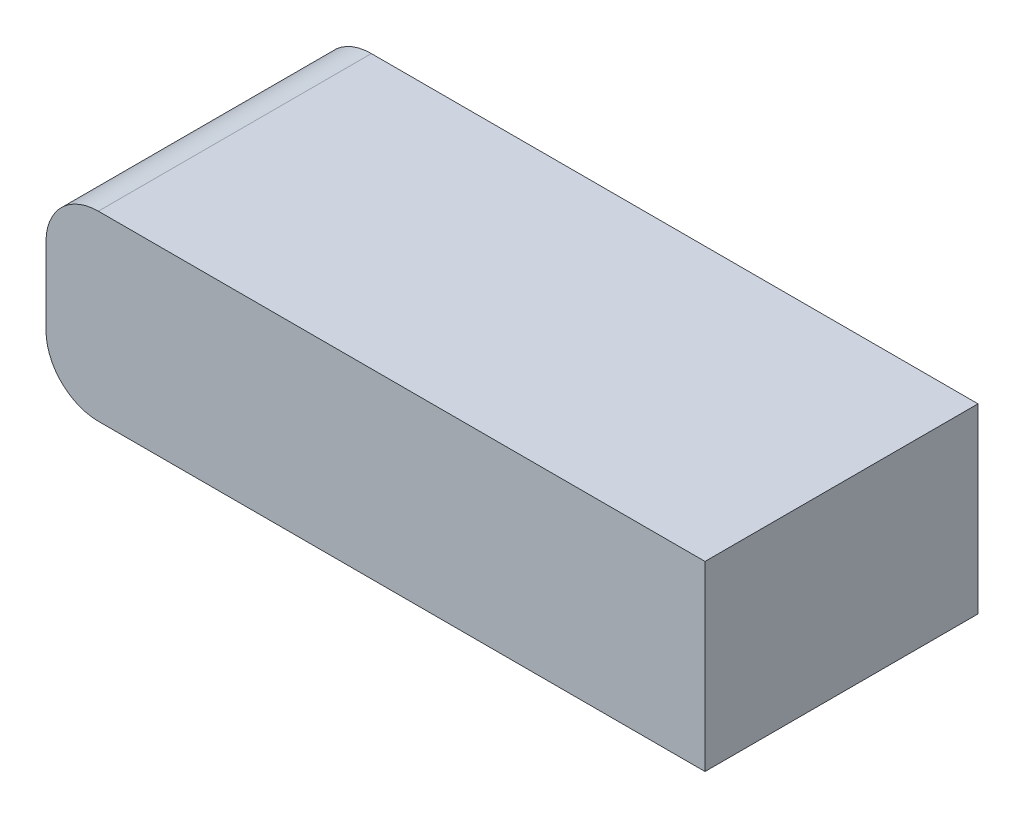
ISO-10303-21;
HEADER;
FILE_DESCRIPTION(('STEP AP214'),'2;1');
FILE_NAME('part.step','',(''),(''),'','','');
FILE_SCHEMA(('AUTOMOTIVE_DESIGN { 1 0 10303 214 1 1 1 1 }'));
ENDSEC;
DATA;
#1=APPLICATION_CONTEXT('core data for automotive mechanical design processes');
#2=APPLICATION_PROTOCOL_DEFINITION('international standard','automotive_design',2000,#1);
#3=PRODUCT_CONTEXT('',#1,'mechanical');
#4=PRODUCT('Part','Part','',(#3));
#5=PRODUCT_RELATED_PRODUCT_CATEGORY('part','',(#4));
#6=PRODUCT_DEFINITION_FORMATION('','',#4);
#7=PRODUCT_DEFINITION_CONTEXT('part definition',#1,'design');
#8=PRODUCT_DEFINITION('design','',#6,#7);
#9=PRODUCT_DEFINITION_SHAPE('','',#8);
#10=(LENGTH_UNIT() NAMED_UNIT(*) SI_UNIT(.MILLI.,.METRE.));
#11=(NAMED_UNIT(*) PLANE_ANGLE_UNIT() SI_UNIT($,.RADIAN.));
#12=(NAMED_UNIT(*) SI_UNIT($,.STERADIAN.) SOLID_ANGLE_UNIT());
#13=UNCERTAINTY_MEASURE_WITH_UNIT(LENGTH_MEASURE(1.E-05),#10,'distance_accuracy_value','');
#14=(GEOMETRIC_REPRESENTATION_CONTEXT(3) GLOBAL_UNCERTAINTY_ASSIGNED_CONTEXT((#13)) GLOBAL_UNIT_ASSIGNED_CONTEXT((#10,
#11,#12)) REPRESENTATION_CONTEXT('',''));
#15=CARTESIAN_POINT('',(0.,0.,0.));
#16=DIRECTION('',(0.,0.,1.));
#17=DIRECTION('',(1.,0.,0.));
#18=AXIS2_PLACEMENT_3D('',#15,#16,#17);
#19=CARTESIAN_POINT('',(0.,30.7028129685967,160.));
#20=DIRECTION('',(0.,0.,-1.));
#21=DIRECTION('',(-1.,0.,0.));
#22=AXIS2_PLACEMENT_3D('',#19,#20,#21);
#23=CYLINDRICAL_SURFACE('',#22,30.7028129685967);
#24=CARTESIAN_POINT('',(0.,30.7028129685967,0.));
#25=DIRECTION('',(0.,0.,1.));
#26=DIRECTION('',(1.,0.,0.));
#27=AXIS2_PLACEMENT_3D('',#24,#25,#26);
#28=CIRCLE('',#27,30.7028129685967);
#29=CARTESIAN_POINT('',(-30.7028129685967,30.7028129685967,0.));
#30=VERTEX_POINT('',#29);
#31=CARTESIAN_POINT('',(0.,0.,0.));
#32=VERTEX_POINT('',#31);
#33=EDGE_CURVE('E117',#30,#32,#28,.T.);
#34=ORIENTED_EDGE('',*,*,#33,.T.);
#35=DIRECTION('',(0.,0.,-1.));
#36=VECTOR('',#35,1.);
#37=CARTESIAN_POINT('',(0.,0.,160.));
#38=LINE('',#37,#36);
#39=CARTESIAN_POINT('',(0.,0.,160.));
#40=VERTEX_POINT('',#39);
#41=EDGE_CURVE('E11',#40,#32,#38,.T.);
#42=ORIENTED_EDGE('',*,*,#41,.F.);
#43=CARTESIAN_POINT('',(0.,30.7028129685967,160.));
#44=DIRECTION('',(0.,0.,1.));
#45=DIRECTION('',(1.,0.,0.));
#46=AXIS2_PLACEMENT_3D('',#43,#44,#45);
#47=CIRCLE('',#46,30.7028129685967);
#48=CARTESIAN_POINT('',(-30.7028129685967,30.7028129685967,160.));
#49=VERTEX_POINT('',#48);
#50=EDGE_CURVE('E127',#49,#40,#47,.T.);
#51=ORIENTED_EDGE('',*,*,#50,.F.);
#52=DIRECTION('',(0.,0.,-1.));
#53=VECTOR('',#52,1.);
#54=CARTESIAN_POINT('',(-30.7028129685967,30.7028129685967,160.));
#55=LINE('',#54,#53);
#56=EDGE_CURVE('E113',#49,#30,#55,.T.);
#57=ORIENTED_EDGE('',*,*,#56,.T.);
#58=EDGE_LOOP('',(#34,#42,#51,#57));
#59=FACE_BOUND('',#58,.T.);
#60=ADVANCED_FACE('F33',(#59),#23,.T.);
#61=CARTESIAN_POINT('',(0.,0.,160.));
#62=DIRECTION('',(0.,1.,0.));
#63=DIRECTION('',(-1.,0.,0.));
#64=AXIS2_PLACEMENT_3D('',#61,#62,#63);
#65=PLANE('',#64);
#66=DIRECTION('',(1.,0.,0.));
#67=VECTOR('',#66,1.);
#68=CARTESIAN_POINT('',(0.,0.,0.));
#69=LINE('',#68,#67);
#70=CARTESIAN_POINT('',(355.55555,0.,0.));
#71=VERTEX_POINT('',#70);
#72=EDGE_CURVE('E120',#32,#71,#69,.T.);
#73=ORIENTED_EDGE('',*,*,#72,.T.);
#74=DIRECTION('',(0.,0.,-1.));
#75=VECTOR('',#74,1.);
#76=CARTESIAN_POINT('',(355.55555,0.,160.));
#77=LINE('',#76,#75);
#78=CARTESIAN_POINT('',(355.55555,0.,160.));
#79=VERTEX_POINT('',#78);
#80=EDGE_CURVE('E41',#79,#71,#77,.T.);
#81=ORIENTED_EDGE('',*,*,#80,.F.);
#82=DIRECTION('',(1.,0.,0.));
#83=VECTOR('',#82,1.);
#84=CARTESIAN_POINT('',(0.,0.,160.));
#85=LINE('',#84,#83);
#86=EDGE_CURVE('E86',#40,#79,#85,.T.);
#87=ORIENTED_EDGE('',*,*,#86,.F.);
#88=ORIENTED_EDGE('',*,*,#41,.T.);
#89=EDGE_LOOP('',(#73,#81,#87,#88));
#90=FACE_BOUND('',#89,.T.);
#91=ADVANCED_FACE('F151',(#90),#65,.F.);
#92=CARTESIAN_POINT('',(355.55555,0.,160.));
#93=DIRECTION('',(-1.,0.,0.));
#94=DIRECTION('',(0.,0.,1.));
#95=AXIS2_PLACEMENT_3D('',#92,#93,#94);
#96=PLANE('',#95);
#97=DIRECTION('',(0.,1.,0.));
#98=VECTOR('',#97,1.);
#99=CARTESIAN_POINT('',(355.55555,0.,0.));
#100=LINE('',#99,#98);
#101=CARTESIAN_POINT('',(355.55555,106.666,0.));
#102=VERTEX_POINT('',#101);
#103=EDGE_CURVE('E122',#71,#102,#100,.T.);
#104=ORIENTED_EDGE('',*,*,#103,.T.);
#105=DIRECTION('',(0.,0.,-1.));
#106=VECTOR('',#105,1.);
#107=CARTESIAN_POINT('',(355.55555,106.666,160.));
#108=LINE('',#107,#106);
#109=CARTESIAN_POINT('',(355.55555,106.666,160.));
#110=VERTEX_POINT('',#109);
#111=EDGE_CURVE('E108',#110,#102,#108,.T.);
#112=ORIENTED_EDGE('',*,*,#111,.F.);
#113=DIRECTION('',(0.,1.,0.));
#114=VECTOR('',#113,1.);
#115=CARTESIAN_POINT('',(355.55555,0.,160.));
#116=LINE('',#115,#114);
#117=EDGE_CURVE('E99',#79,#110,#116,.T.);
#118=ORIENTED_EDGE('',*,*,#117,.F.);
#119=ORIENTED_EDGE('',*,*,#80,.T.);
#120=EDGE_LOOP('',(#104,#112,#118,#119));
#121=FACE_BOUND('',#120,.T.);
#122=ADVANCED_FACE('F133',(#121),#96,.F.);
#123=CARTESIAN_POINT('',(355.55555,106.666,160.));
#124=DIRECTION('',(0.,-1.,0.));
#125=DIRECTION('',(1.,0.,0.));
#126=AXIS2_PLACEMENT_3D('',#123,#124,#125);
#127=PLANE('',#126);
#128=DIRECTION('',(-1.,0.,0.));
#129=VECTOR('',#128,1.);
#130=CARTESIAN_POINT('',(355.55555,106.666,0.));
#131=LINE('',#130,#129);
#132=CARTESIAN_POINT('',(0.,106.666,0.));
#133=VERTEX_POINT('',#132);
#134=EDGE_CURVE('E107',#102,#133,#131,.T.);
#135=ORIENTED_EDGE('',*,*,#134,.T.);
#136=DIRECTION('',(0.,0.,-1.));
#137=VECTOR('',#136,1.);
#138=CARTESIAN_POINT('',(0.,106.666,160.));
#139=LINE('',#138,#137);
#140=CARTESIAN_POINT('',(0.,106.666,160.));
#141=VERTEX_POINT('',#140);
#142=EDGE_CURVE('E104',#141,#133,#139,.T.);
#143=ORIENTED_EDGE('',*,*,#142,.F.);
#144=DIRECTION('',(-1.,0.,0.));
#145=VECTOR('',#144,1.);
#146=CARTESIAN_POINT('',(355.55555,106.666,160.));
#147=LINE('',#146,#145);
#148=EDGE_CURVE('E93',#110,#141,#147,.T.);
#149=ORIENTED_EDGE('',*,*,#148,.F.);
#150=ORIENTED_EDGE('',*,*,#111,.T.);
#151=EDGE_LOOP('',(#135,#143,#149,#150));
#152=FACE_BOUND('',#151,.T.);
#153=ADVANCED_FACE('F105',(#152),#127,.F.);
#154=CARTESIAN_POINT('',(0.,75.9631870314032,160.));
#155=DIRECTION('',(0.,0.,-1.));
#156=DIRECTION('',(-1.,0.,0.));
#157=AXIS2_PLACEMENT_3D('',#154,#155,#156);
#158=CYLINDRICAL_SURFACE('',#157,30.7028129685967);
#159=CARTESIAN_POINT('',(0.,75.9631870314032,0.));
#160=DIRECTION('',(0.,0.,1.));
#161=DIRECTION('',(1.,0.,0.));
#162=AXIS2_PLACEMENT_3D('',#159,#160,#161);
#163=CIRCLE('',#162,30.7028129685967);
#164=CARTESIAN_POINT('',(-30.7028129685967,75.9631870314032,0.));
#165=VERTEX_POINT('',#164);
#166=EDGE_CURVE('E72',#133,#165,#163,.T.);
#167=ORIENTED_EDGE('',*,*,#166,.T.);
#168=DIRECTION('',(0.,0.,-1.));
#169=VECTOR('',#168,1.);
#170=CARTESIAN_POINT('',(-30.7028129685967,75.9631870314032,160.));
#171=LINE('',#170,#169);
#172=CARTESIAN_POINT('',(-30.7028129685967,75.9631870314032,160.));
#173=VERTEX_POINT('',#172);
#174=EDGE_CURVE('E109',#173,#165,#171,.T.);
#175=ORIENTED_EDGE('',*,*,#174,.F.);
#176=CARTESIAN_POINT('',(0.,75.9631870314032,160.));
#177=DIRECTION('',(0.,0.,1.));
#178=DIRECTION('',(1.,0.,0.));
#179=AXIS2_PLACEMENT_3D('',#176,#177,#178);
#180=CIRCLE('',#179,30.7028129685967);
#181=EDGE_CURVE('E97',#141,#173,#180,.T.);
#182=ORIENTED_EDGE('',*,*,#181,.F.);
#183=ORIENTED_EDGE('',*,*,#142,.T.);
#184=EDGE_LOOP('',(#167,#175,#182,#183));
#185=FACE_BOUND('',#184,.T.);
#186=ADVANCED_FACE('F111',(#185),#158,.T.);
#187=CARTESIAN_POINT('',(-30.7028129685967,75.9631870314032,160.));
#188=DIRECTION('',(1.,0.,0.));
#189=DIRECTION('',(0.,1.,0.));
#190=AXIS2_PLACEMENT_3D('',#187,#188,#189);
#191=PLANE('',#190);
#192=DIRECTION('',(0.,-1.,0.));
#193=VECTOR('',#192,1.);
#194=CARTESIAN_POINT('',(-30.7028129685967,75.9631870314032,0.));
#195=LINE('',#194,#193);
#196=EDGE_CURVE('E78',#165,#30,#195,.T.);
#197=ORIENTED_EDGE('',*,*,#196,.T.);
#198=ORIENTED_EDGE('',*,*,#56,.F.);
#199=DIRECTION('',(0.,-1.,0.));
#200=VECTOR('',#199,1.);
#201=CARTESIAN_POINT('',(-30.7028129685967,75.9631870314032,160.));
#202=LINE('',#201,#200);
#203=EDGE_CURVE('E49',#173,#49,#202,.T.);
#204=ORIENTED_EDGE('',*,*,#203,.F.);
#205=ORIENTED_EDGE('',*,*,#174,.T.);
#206=EDGE_LOOP('',(#197,#198,#204,#205));
#207=FACE_BOUND('',#206,.T.);
#208=ADVANCED_FACE('F140',(#207),#191,.F.);
#209=CARTESIAN_POINT('',(0.,30.7028129685967,160.));
#210=DIRECTION('',(0.,0.,1.));
#211=DIRECTION('',(1.,0.,0.));
#212=AXIS2_PLACEMENT_3D('',#209,#210,#211);
#213=PLANE('',#212);
#214=ORIENTED_EDGE('',*,*,#50,.T.);
#215=ORIENTED_EDGE('',*,*,#86,.T.);
#216=ORIENTED_EDGE('',*,*,#117,.T.);
#217=ORIENTED_EDGE('',*,*,#148,.T.);
#218=ORIENTED_EDGE('',*,*,#181,.T.);
#219=ORIENTED_EDGE('',*,*,#203,.T.);
#220=EDGE_LOOP('',(#214,#215,#216,#217,#218,#219));
#221=FACE_BOUND('',#220,.T.);
#222=ADVANCED_FACE('F95',(#221),#213,.T.);
#223=CARTESIAN_POINT('',(0.,30.7028129685967,0.));
#224=DIRECTION('',(0.,0.,1.));
#225=DIRECTION('',(1.,0.,0.));
#226=AXIS2_PLACEMENT_3D('',#223,#224,#225);
#227=PLANE('',#226);
#228=ORIENTED_EDGE('',*,*,#33,.F.);
#229=ORIENTED_EDGE('',*,*,#196,.F.);
#230=ORIENTED_EDGE('',*,*,#166,.F.);
#231=ORIENTED_EDGE('',*,*,#134,.F.);
#232=ORIENTED_EDGE('',*,*,#103,.F.);
#233=ORIENTED_EDGE('',*,*,#72,.F.);
#234=EDGE_LOOP('',(#228,#229,#230,#231,#232,#233));
#235=FACE_BOUND('',#234,.T.);
#236=ADVANCED_FACE('F136',(#235),#227,.F.);
#237=CLOSED_SHELL('',(#60,#91,#122,#153,#186,#208,#222,#236));
#238=MANIFOLD_SOLID_BREP('B2',#237);
#239=ADVANCED_BREP_SHAPE_REPRESENTATION('',(#18,#238),#14);
#240=SHAPE_DEFINITION_REPRESENTATION(#9,#239);
ENDSEC;
END-ISO-10303-21;
